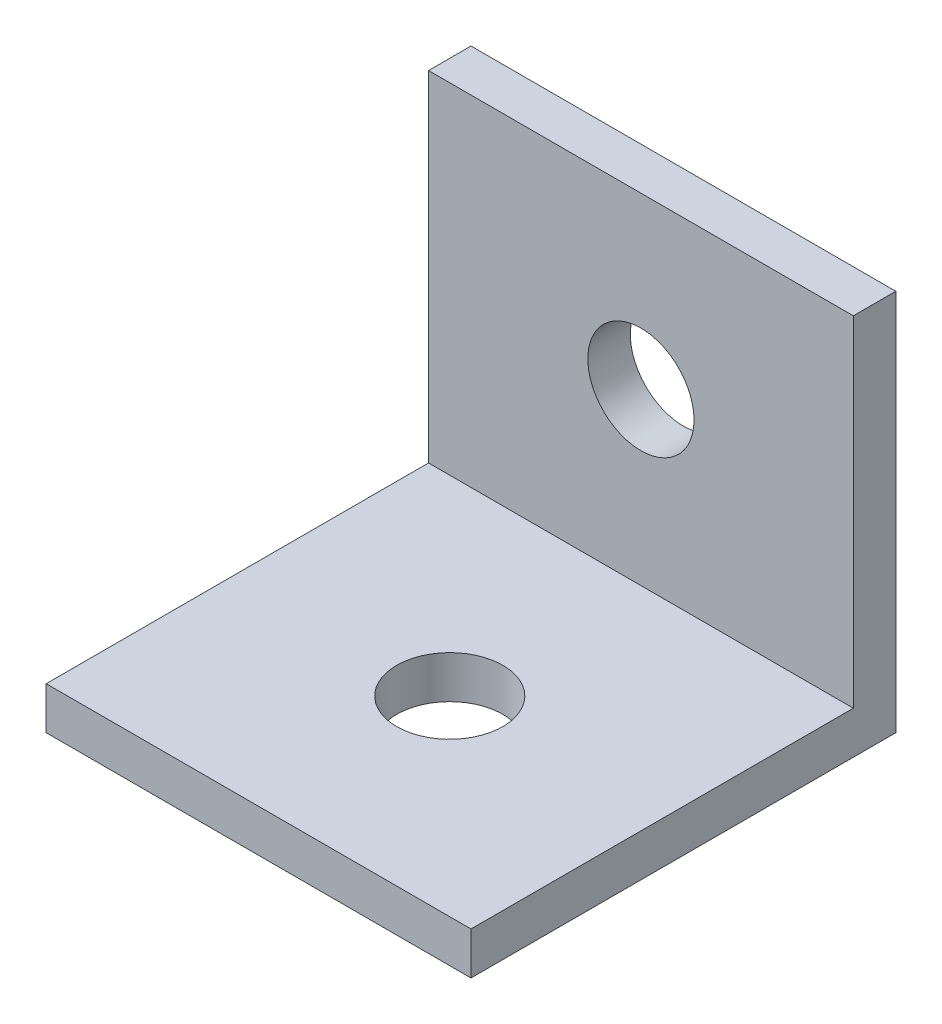
ISO-10303-21;
HEADER;
FILE_DESCRIPTION(('STEP AP214'),'2;1');
FILE_NAME('part.step','',(''),(''),'','','');
FILE_SCHEMA(('AUTOMOTIVE_DESIGN { 1 0 10303 214 1 1 1 1 }'));
ENDSEC;
DATA;
#1=APPLICATION_CONTEXT('core data for automotive mechanical design processes');
#2=APPLICATION_PROTOCOL_DEFINITION('international standard','automotive_design',2000,#1);
#3=PRODUCT_CONTEXT('',#1,'mechanical');
#4=PRODUCT('Part','Part','',(#3));
#5=PRODUCT_RELATED_PRODUCT_CATEGORY('part','',(#4));
#6=PRODUCT_DEFINITION_FORMATION('','',#4);
#7=PRODUCT_DEFINITION_CONTEXT('part definition',#1,'design');
#8=PRODUCT_DEFINITION('design','',#6,#7);
#9=PRODUCT_DEFINITION_SHAPE('','',#8);
#10=(LENGTH_UNIT() NAMED_UNIT(*) SI_UNIT(.MILLI.,.METRE.));
#11=(NAMED_UNIT(*) PLANE_ANGLE_UNIT() SI_UNIT($,.RADIAN.));
#12=(NAMED_UNIT(*) SI_UNIT($,.STERADIAN.) SOLID_ANGLE_UNIT());
#13=UNCERTAINTY_MEASURE_WITH_UNIT(LENGTH_MEASURE(1.E-05),#10,'distance_accuracy_value','');
#14=(GEOMETRIC_REPRESENTATION_CONTEXT(3) GLOBAL_UNCERTAINTY_ASSIGNED_CONTEXT((#13)) GLOBAL_UNIT_ASSIGNED_CONTEXT((#10,
#11,#12)) REPRESENTATION_CONTEXT('',''));
#15=CARTESIAN_POINT('',(0.,0.,0.));
#16=DIRECTION('',(0.,0.,1.));
#17=DIRECTION('',(1.,0.,0.));
#18=AXIS2_PLACEMENT_3D('',#15,#16,#17);
#19=CARTESIAN_POINT('',(-10.,2.,10.));
#20=DIRECTION('',(1.,0.,0.));
#21=DIRECTION('',(0.,0.,-1.));
#22=AXIS2_PLACEMENT_3D('',#19,#20,#21);
#23=PLANE('',#22);
#24=DIRECTION('',(0.,0.,1.));
#25=VECTOR('',#24,1.);
#26=CARTESIAN_POINT('',(-10.,0.,10.));
#27=LINE('',#26,#25);
#28=CARTESIAN_POINT('',(-10.,0.,-10.));
#29=VERTEX_POINT('',#28);
#30=CARTESIAN_POINT('',(-10.,0.,10.));
#31=VERTEX_POINT('',#30);
#32=EDGE_CURVE('E93',#29,#31,#27,.T.);
#33=ORIENTED_EDGE('',*,*,#32,.T.);
#34=DIRECTION('',(0.,-1.,0.));
#35=VECTOR('',#34,1.);
#36=CARTESIAN_POINT('',(-10.,2.,10.));
#37=LINE('',#36,#35);
#38=CARTESIAN_POINT('',(-10.,2.,10.));
#39=VERTEX_POINT('',#38);
#40=EDGE_CURVE('E11',#39,#31,#37,.T.);
#41=ORIENTED_EDGE('',*,*,#40,.F.);
#42=DIRECTION('',(0.,0.,1.));
#43=VECTOR('',#42,1.);
#44=CARTESIAN_POINT('',(-10.,2.,10.));
#45=LINE('',#44,#43);
#46=CARTESIAN_POINT('',(-10.,2.,-8.));
#47=VERTEX_POINT('',#46);
#48=EDGE_CURVE('E86',#47,#39,#45,.T.);
#49=ORIENTED_EDGE('',*,*,#48,.F.);
#50=DIRECTION('',(0.,-1.,0.));
#51=VECTOR('',#50,1.);
#52=CARTESIAN_POINT('',(-10.,18.,-8.));
#53=LINE('',#52,#51);
#54=CARTESIAN_POINT('',(-10.,18.,-8.));
#55=VERTEX_POINT('',#54);
#56=EDGE_CURVE('E101',#55,#47,#53,.T.);
#57=ORIENTED_EDGE('',*,*,#56,.F.);
#58=DIRECTION('',(0.,0.,1.));
#59=VECTOR('',#58,1.);
#60=CARTESIAN_POINT('',(-10.,18.,-10.));
#61=LINE('',#60,#59);
#62=CARTESIAN_POINT('',(-10.,18.,-10.));
#63=VERTEX_POINT('',#62);
#64=EDGE_CURVE('E96',#63,#55,#61,.T.);
#65=ORIENTED_EDGE('',*,*,#64,.F.);
#66=DIRECTION('',(0.,-1.,0.));
#67=VECTOR('',#66,1.);
#68=CARTESIAN_POINT('',(-10.,2.,-10.));
#69=LINE('',#68,#67);
#70=EDGE_CURVE('E79',#63,#29,#69,.T.);
#71=ORIENTED_EDGE('',*,*,#70,.T.);
#72=EDGE_LOOP('',(#33,#41,#49,#57,#65,#71));
#73=FACE_BOUND('',#72,.T.);
#74=ADVANCED_FACE('F35',(#73),#23,.F.);
#75=CARTESIAN_POINT('',(10.,2.,10.));
#76=DIRECTION('',(0.,0.,-1.));
#77=DIRECTION('',(-1.,0.,0.));
#78=AXIS2_PLACEMENT_3D('',#75,#76,#77);
#79=PLANE('',#78);
#80=DIRECTION('',(1.,0.,0.));
#81=VECTOR('',#80,1.);
#82=CARTESIAN_POINT('',(10.,0.,10.));
#83=LINE('',#82,#81);
#84=CARTESIAN_POINT('',(10.,0.,10.));
#85=VERTEX_POINT('',#84);
#86=EDGE_CURVE('E100',#31,#85,#83,.T.);
#87=ORIENTED_EDGE('',*,*,#86,.T.);
#88=DIRECTION('',(0.,-1.,0.));
#89=VECTOR('',#88,1.);
#90=CARTESIAN_POINT('',(10.,2.,10.));
#91=LINE('',#90,#89);
#92=CARTESIAN_POINT('',(10.,2.,10.));
#93=VERTEX_POINT('',#92);
#94=EDGE_CURVE('E42',#93,#85,#91,.T.);
#95=ORIENTED_EDGE('',*,*,#94,.F.);
#96=DIRECTION('',(1.,0.,0.));
#97=VECTOR('',#96,1.);
#98=CARTESIAN_POINT('',(10.,2.,10.));
#99=LINE('',#98,#97);
#100=EDGE_CURVE('E55',#39,#93,#99,.T.);
#101=ORIENTED_EDGE('',*,*,#100,.F.);
#102=ORIENTED_EDGE('',*,*,#40,.T.);
#103=EDGE_LOOP('',(#87,#95,#101,#102));
#104=FACE_BOUND('',#103,.T.);
#105=ADVANCED_FACE('F117',(#104),#79,.F.);
#106=CARTESIAN_POINT('',(10.,2.,10.));
#107=DIRECTION('',(-1.,0.,0.));
#108=DIRECTION('',(0.,0.,1.));
#109=AXIS2_PLACEMENT_3D('',#106,#107,#108);
#110=PLANE('',#109);
#111=DIRECTION('',(0.,0.,-1.));
#112=VECTOR('',#111,1.);
#113=CARTESIAN_POINT('',(10.,0.,10.));
#114=LINE('',#113,#112);
#115=CARTESIAN_POINT('',(10.,0.,-10.));
#116=VERTEX_POINT('',#115);
#117=EDGE_CURVE('E87',#85,#116,#114,.T.);
#118=ORIENTED_EDGE('',*,*,#117,.T.);
#119=DIRECTION('',(0.,-1.,0.));
#120=VECTOR('',#119,1.);
#121=CARTESIAN_POINT('',(10.,2.,-10.));
#122=LINE('',#121,#120);
#123=CARTESIAN_POINT('',(10.,18.,-10.));
#124=VERTEX_POINT('',#123);
#125=EDGE_CURVE('E82',#124,#116,#122,.T.);
#126=ORIENTED_EDGE('',*,*,#125,.F.);
#127=DIRECTION('',(0.,0.,-1.));
#128=VECTOR('',#127,1.);
#129=CARTESIAN_POINT('',(10.,18.,-10.));
#130=LINE('',#129,#128);
#131=CARTESIAN_POINT('',(10.,18.,-8.));
#132=VERTEX_POINT('',#131);
#133=EDGE_CURVE('E132',#132,#124,#130,.T.);
#134=ORIENTED_EDGE('',*,*,#133,.F.);
#135=DIRECTION('',(0.,-1.,0.));
#136=VECTOR('',#135,1.);
#137=CARTESIAN_POINT('',(10.,18.,-8.));
#138=LINE('',#137,#136);
#139=CARTESIAN_POINT('',(10.,2.,-8.));
#140=VERTEX_POINT('',#139);
#141=EDGE_CURVE('E105',#132,#140,#138,.T.);
#142=ORIENTED_EDGE('',*,*,#141,.T.);
#143=DIRECTION('',(0.,0.,-1.));
#144=VECTOR('',#143,1.);
#145=CARTESIAN_POINT('',(10.,2.,10.));
#146=LINE('',#145,#144);
#147=EDGE_CURVE('E97',#93,#140,#146,.T.);
#148=ORIENTED_EDGE('',*,*,#147,.F.);
#149=ORIENTED_EDGE('',*,*,#94,.T.);
#150=EDGE_LOOP('',(#118,#126,#134,#142,#148,#149));
#151=FACE_BOUND('',#150,.T.);
#152=ADVANCED_FACE('F114',(#151),#110,.F.);
#153=CARTESIAN_POINT('',(10.,2.,-10.));
#154=DIRECTION('',(0.,0.,1.));
#155=DIRECTION('',(1.,0.,0.));
#156=AXIS2_PLACEMENT_3D('',#153,#154,#155);
#157=PLANE('',#156);
#158=CARTESIAN_POINT('',(0.,10.,-10.));
#159=DIRECTION('',(0.,0.,1.));
#160=DIRECTION('',(1.,0.,0.));
#161=AXIS2_PLACEMENT_3D('',#158,#159,#160);
#162=CIRCLE('',#161,2.5);
#163=CARTESIAN_POINT('',(2.5,10.,-10.));
#164=VERTEX_POINT('',#163);
#165=EDGE_CURVE('E250',#164,#164,#162,.T.);
#166=ORIENTED_EDGE('',*,*,#165,.T.);
#167=EDGE_LOOP('',(#166));
#168=FACE_BOUND('',#167,.T.);
#169=DIRECTION('',(-1.,0.,0.));
#170=VECTOR('',#169,1.);
#171=CARTESIAN_POINT('',(10.,0.,-10.));
#172=LINE('',#171,#170);
#173=EDGE_CURVE('E75',#116,#29,#172,.T.);
#174=ORIENTED_EDGE('',*,*,#173,.T.);
#175=ORIENTED_EDGE('',*,*,#70,.F.);
#176=DIRECTION('',(-1.,0.,0.));
#177=VECTOR('',#176,1.);
#178=CARTESIAN_POINT('',(-10.,18.,-10.));
#179=LINE('',#178,#177);
#180=EDGE_CURVE('E135',#124,#63,#179,.T.);
#181=ORIENTED_EDGE('',*,*,#180,.F.);
#182=ORIENTED_EDGE('',*,*,#125,.T.);
#183=EDGE_LOOP('',(#174,#175,#181,#182));
#184=FACE_BOUND('',#183,.T.);
#185=ADVANCED_FACE('F77',(#168,#184),#157,.F.);
#186=CARTESIAN_POINT('',(0.,2.,0.));
#187=DIRECTION('',(0.,1.,0.));
#188=DIRECTION('',(0.,0.,1.));
#189=AXIS2_PLACEMENT_3D('',#186,#187,#188);
#190=PLANE('',#189);
#191=CARTESIAN_POINT('',(0.,2.,1.));
#192=DIRECTION('',(0.,1.,0.));
#193=DIRECTION('',(0.,0.,1.));
#194=AXIS2_PLACEMENT_3D('',#191,#192,#193);
#195=CIRCLE('',#194,2.5);
#196=CARTESIAN_POINT('',(0.,2.,3.5));
#197=VERTEX_POINT('',#196);
#198=EDGE_CURVE('E140',#197,#197,#195,.T.);
#199=ORIENTED_EDGE('',*,*,#198,.F.);
#200=EDGE_LOOP('',(#199));
#201=FACE_BOUND('',#200,.T.);
#202=DIRECTION('',(1.,0.,0.));
#203=VECTOR('',#202,1.);
#204=CARTESIAN_POINT('',(-10.,2.,-8.));
#205=LINE('',#204,#203);
#206=EDGE_CURVE('E49',#47,#140,#205,.T.);
#207=ORIENTED_EDGE('',*,*,#206,.F.);
#208=ORIENTED_EDGE('',*,*,#48,.T.);
#209=ORIENTED_EDGE('',*,*,#100,.T.);
#210=ORIENTED_EDGE('',*,*,#147,.T.);
#211=EDGE_LOOP('',(#207,#208,#209,#210));
#212=FACE_BOUND('',#211,.T.);
#213=ADVANCED_FACE('F145',(#201,#212),#190,.T.);
#214=CARTESIAN_POINT('',(0.,0.,0.));
#215=DIRECTION('',(0.,1.,0.));
#216=DIRECTION('',(0.,0.,1.));
#217=AXIS2_PLACEMENT_3D('',#214,#215,#216);
#218=PLANE('',#217);
#219=CARTESIAN_POINT('',(0.,0.,1.));
#220=DIRECTION('',(0.,1.,0.));
#221=DIRECTION('',(0.,0.,1.));
#222=AXIS2_PLACEMENT_3D('',#219,#220,#221);
#223=CIRCLE('',#222,2.5);
#224=CARTESIAN_POINT('',(0.,0.,3.5));
#225=VERTEX_POINT('',#224);
#226=EDGE_CURVE('E137',#225,#225,#223,.T.);
#227=ORIENTED_EDGE('',*,*,#226,.T.);
#228=EDGE_LOOP('',(#227));
#229=FACE_BOUND('',#228,.T.);
#230=ORIENTED_EDGE('',*,*,#32,.F.);
#231=ORIENTED_EDGE('',*,*,#173,.F.);
#232=ORIENTED_EDGE('',*,*,#117,.F.);
#233=ORIENTED_EDGE('',*,*,#86,.F.);
#234=EDGE_LOOP('',(#230,#231,#232,#233));
#235=FACE_BOUND('',#234,.T.);
#236=ADVANCED_FACE('F99',(#229,#235),#218,.F.);
#237=CARTESIAN_POINT('',(-10.,18.,-8.));
#238=DIRECTION('',(0.,0.,-1.));
#239=DIRECTION('',(-1.,0.,0.));
#240=AXIS2_PLACEMENT_3D('',#237,#238,#239);
#241=PLANE('',#240);
#242=CARTESIAN_POINT('',(0.,10.,-8.));
#243=DIRECTION('',(0.,0.,1.));
#244=DIRECTION('',(1.,0.,0.));
#245=AXIS2_PLACEMENT_3D('',#242,#243,#244);
#246=CIRCLE('',#245,2.5);
#247=CARTESIAN_POINT('',(2.5,10.,-8.));
#248=VERTEX_POINT('',#247);
#249=EDGE_CURVE('E252',#248,#248,#246,.T.);
#250=ORIENTED_EDGE('',*,*,#249,.F.);
#251=EDGE_LOOP('',(#250));
#252=FACE_BOUND('',#251,.T.);
#253=ORIENTED_EDGE('',*,*,#206,.T.);
#254=ORIENTED_EDGE('',*,*,#141,.F.);
#255=DIRECTION('',(1.,0.,0.));
#256=VECTOR('',#255,1.);
#257=CARTESIAN_POINT('',(-10.,18.,-8.));
#258=LINE('',#257,#256);
#259=EDGE_CURVE('E126',#55,#132,#258,.T.);
#260=ORIENTED_EDGE('',*,*,#259,.F.);
#261=ORIENTED_EDGE('',*,*,#56,.T.);
#262=EDGE_LOOP('',(#253,#254,#260,#261));
#263=FACE_BOUND('',#262,.T.);
#264=ADVANCED_FACE('F122',(#252,#263),#241,.F.);
#265=CARTESIAN_POINT('',(0.,18.,0.));
#266=DIRECTION('',(0.,1.,0.));
#267=DIRECTION('',(0.,0.,1.));
#268=AXIS2_PLACEMENT_3D('',#265,#266,#267);
#269=PLANE('',#268);
#270=ORIENTED_EDGE('',*,*,#64,.T.);
#271=ORIENTED_EDGE('',*,*,#259,.T.);
#272=ORIENTED_EDGE('',*,*,#133,.T.);
#273=ORIENTED_EDGE('',*,*,#180,.T.);
#274=EDGE_LOOP('',(#270,#271,#272,#273));
#275=FACE_BOUND('',#274,.T.);
#276=ADVANCED_FACE('F134',(#275),#269,.T.);
#277=CARTESIAN_POINT('',(0.,0.,1.));
#278=DIRECTION('',(0.,1.,0.));
#279=DIRECTION('',(0.,0.,1.));
#280=AXIS2_PLACEMENT_3D('',#277,#278,#279);
#281=CYLINDRICAL_SURFACE('',#280,2.5);
#282=ORIENTED_EDGE('',*,*,#226,.F.);
#283=EDGE_LOOP('',(#282));
#284=FACE_BOUND('',#283,.T.);
#285=ORIENTED_EDGE('',*,*,#198,.T.);
#286=EDGE_LOOP('',(#285));
#287=FACE_BOUND('',#286,.T.);
#288=ADVANCED_FACE('F186',(#284,#287),#281,.F.);
#289=CARTESIAN_POINT('',(0.,10.,-10.));
#290=DIRECTION('',(0.,0.,1.));
#291=DIRECTION('',(1.,0.,0.));
#292=AXIS2_PLACEMENT_3D('',#289,#290,#291);
#293=CYLINDRICAL_SURFACE('',#292,2.5);
#294=ORIENTED_EDGE('',*,*,#165,.F.);
#295=EDGE_LOOP('',(#294));
#296=FACE_BOUND('',#295,.T.);
#297=ORIENTED_EDGE('',*,*,#249,.T.);
#298=EDGE_LOOP('',(#297));
#299=FACE_BOUND('',#298,.T.);
#300=ADVANCED_FACE('F200',(#296,#299),#293,.F.);
#301=CLOSED_SHELL('',(#74,#105,#152,#185,#213,#236,#264,#276,#288,#300));
#302=MANIFOLD_SOLID_BREP('B2',#301);
#303=ADVANCED_BREP_SHAPE_REPRESENTATION('',(#18,#302),#14);
#304=SHAPE_DEFINITION_REPRESENTATION(#9,#303);
ENDSEC;
END-ISO-10303-21;
